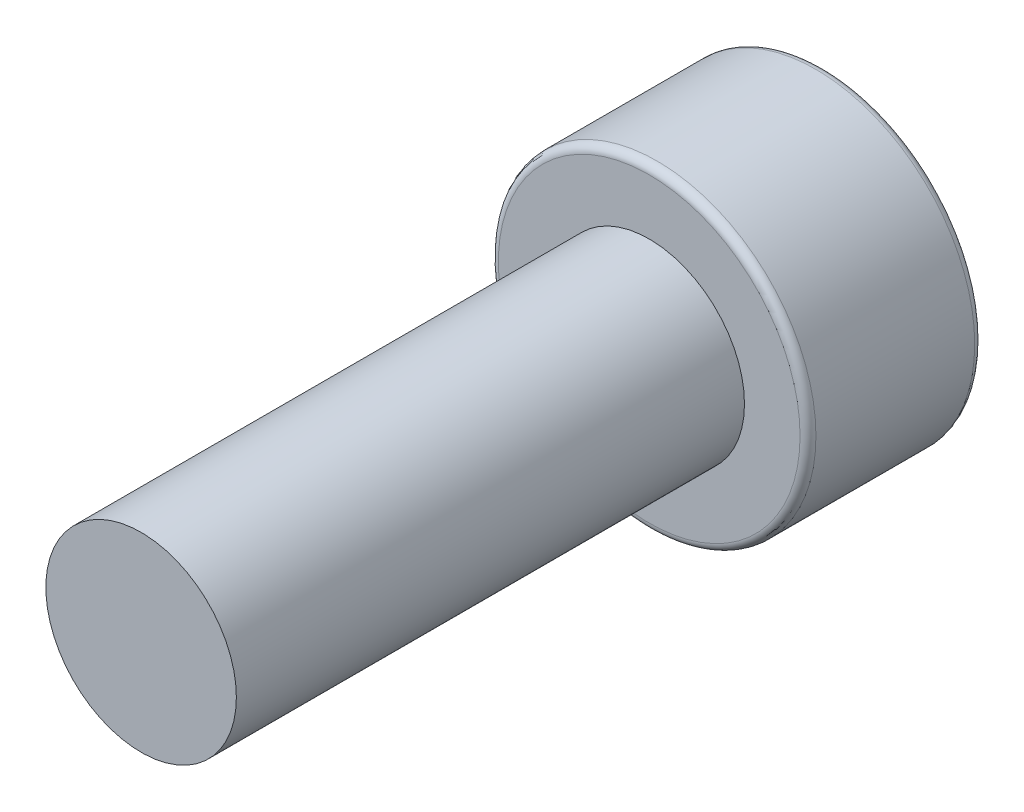
ISO-10303-21;
HEADER;
FILE_DESCRIPTION(('STEP AP214'),'2;1');
FILE_NAME('part.step','',(''),(''),'','','');
FILE_SCHEMA(('AUTOMOTIVE_DESIGN { 1 0 10303 214 1 1 1 1 }'));
ENDSEC;
DATA;
#1=APPLICATION_CONTEXT('core data for automotive mechanical design processes');
#2=APPLICATION_PROTOCOL_DEFINITION('international standard','automotive_design',2000,#1);
#3=PRODUCT_CONTEXT('',#1,'mechanical');
#4=PRODUCT('Part','Part','',(#3));
#5=PRODUCT_RELATED_PRODUCT_CATEGORY('part','',(#4));
#6=PRODUCT_DEFINITION_FORMATION('','',#4);
#7=PRODUCT_DEFINITION_CONTEXT('part definition',#1,'design');
#8=PRODUCT_DEFINITION('design','',#6,#7);
#9=PRODUCT_DEFINITION_SHAPE('','',#8);
#10=(LENGTH_UNIT() NAMED_UNIT(*) SI_UNIT(.MILLI.,.METRE.));
#11=(NAMED_UNIT(*) PLANE_ANGLE_UNIT() SI_UNIT($,.RADIAN.));
#12=(NAMED_UNIT(*) SI_UNIT($,.STERADIAN.) SOLID_ANGLE_UNIT());
#13=UNCERTAINTY_MEASURE_WITH_UNIT(LENGTH_MEASURE(1.E-05),#10,'distance_accuracy_value','');
#14=(GEOMETRIC_REPRESENTATION_CONTEXT(3) GLOBAL_UNCERTAINTY_ASSIGNED_CONTEXT((#13)) GLOBAL_UNIT_ASSIGNED_CONTEXT((#10,
#11,#12)) REPRESENTATION_CONTEXT('',''));
#15=CARTESIAN_POINT('',(0.,0.,0.));
#16=DIRECTION('',(0.,0.,1.));
#17=DIRECTION('',(1.,0.,0.));
#18=AXIS2_PLACEMENT_3D('',#15,#16,#17);
#19=CARTESIAN_POINT('',(0.,0.,2.75));
#20=DIRECTION('',(0.,0.,1.));
#21=DIRECTION('',(1.,0.,0.));
#22=AXIS2_PLACEMENT_3D('',#19,#20,#21);
#23=PLANE('',#22);
#24=CARTESIAN_POINT('',(0.,0.,2.75));
#25=DIRECTION('',(0.,0.,1.));
#26=DIRECTION('',(1.,0.,0.));
#27=AXIS2_PLACEMENT_3D('',#24,#25,#26);
#28=CIRCLE('',#27,2.375);
#29=CARTESIAN_POINT('',(2.375,0.,2.75));
#30=VERTEX_POINT('',#29);
#31=EDGE_CURVE('E11',#30,#30,#28,.T.);
#32=ORIENTED_EDGE('',*,*,#31,.T.);
#33=EDGE_LOOP('',(#32));
#34=FACE_BOUND('',#33,.T.);
#35=CARTESIAN_POINT('',(0.,0.,2.75));
#36=DIRECTION('',(0.,0.,1.));
#37=DIRECTION('',(1.,0.,0.));
#38=AXIS2_PLACEMENT_3D('',#35,#36,#37);
#39=CIRCLE('',#38,1.5);
#40=CARTESIAN_POINT('',(1.5,0.,2.75));
#41=VERTEX_POINT('',#40);
#42=EDGE_CURVE('E267',#41,#41,#39,.T.);
#43=ORIENTED_EDGE('',*,*,#42,.F.);
#44=EDGE_LOOP('',(#43));
#45=FACE_BOUND('',#44,.T.);
#46=ADVANCED_FACE('F33',(#34,#45),#23,.T.);
#47=CARTESIAN_POINT('',(0.,0.,2.75));
#48=DIRECTION('',(0.,0.,-1.));
#49=DIRECTION('',(-1.,0.,0.));
#50=AXIS2_PLACEMENT_3D('',#47,#48,#49);
#51=CYLINDRICAL_SURFACE('',#50,2.5);
#52=CARTESIAN_POINT('',(0.,0.,0.125));
#53=DIRECTION('',(0.,0.,1.));
#54=DIRECTION('',(1.,0.,0.));
#55=AXIS2_PLACEMENT_3D('',#52,#53,#54);
#56=CIRCLE('',#55,2.5);
#57=CARTESIAN_POINT('',(2.5,0.,0.125));
#58=VERTEX_POINT('',#57);
#59=EDGE_CURVE('E42',#58,#58,#56,.T.);
#60=ORIENTED_EDGE('',*,*,#59,.T.);
#61=EDGE_LOOP('',(#60));
#62=FACE_BOUND('',#61,.T.);
#63=CARTESIAN_POINT('',(0.,0.,2.625));
#64=DIRECTION('',(0.,0.,1.));
#65=DIRECTION('',(1.,0.,0.));
#66=AXIS2_PLACEMENT_3D('',#63,#64,#65);
#67=CIRCLE('',#66,2.5);
#68=CARTESIAN_POINT('',(2.5,0.,2.625));
#69=VERTEX_POINT('',#68);
#70=EDGE_CURVE('E208',#69,#69,#67,.F.);
#71=ORIENTED_EDGE('',*,*,#70,.T.);
#72=EDGE_LOOP('',(#71));
#73=FACE_BOUND('',#72,.T.);
#74=ADVANCED_FACE('F314',(#62,#73),#51,.T.);
#75=CARTESIAN_POINT('',(0.,0.,0.));
#76=DIRECTION('',(0.,0.,1.));
#77=DIRECTION('',(1.,0.,0.));
#78=AXIS2_PLACEMENT_3D('',#75,#76,#77);
#79=PLANE('',#78);
#80=DIRECTION('',(0.5,-0.866025403784439,0.));
#81=VECTOR('',#80,1.);
#82=CARTESIAN_POINT('',(1.1907849302036,0.6875,0.));
#83=LINE('',#82,#81);
#84=CARTESIAN_POINT('',(1.58771324027147,0.,0.));
#85=VERTEX_POINT('',#84);
#86=CARTESIAN_POINT('',(0.793856620135735,1.375,0.));
#87=VERTEX_POINT('',#86);
#88=EDGE_CURVE('E195',#85,#87,#83,.F.);
#89=ORIENTED_EDGE('',*,*,#88,.T.);
#90=DIRECTION('',(1.,0.,0.));
#91=VECTOR('',#90,1.);
#92=CARTESIAN_POINT('',(0.,1.375,0.));
#93=LINE('',#92,#91);
#94=CARTESIAN_POINT('',(-0.793856620135735,1.375,0.));
#95=VERTEX_POINT('',#94);
#96=EDGE_CURVE('E197',#87,#95,#93,.F.);
#97=ORIENTED_EDGE('',*,*,#96,.T.);
#98=DIRECTION('',(0.5,0.866025403784438,0.));
#99=VECTOR('',#98,1.);
#100=CARTESIAN_POINT('',(-1.1907849302036,0.687500000000001,0.));
#101=LINE('',#100,#99);
#102=CARTESIAN_POINT('',(-1.58771324027147,0.,0.));
#103=VERTEX_POINT('',#102);
#104=EDGE_CURVE('E187',#95,#103,#101,.F.);
#105=ORIENTED_EDGE('',*,*,#104,.T.);
#106=DIRECTION('',(-0.5,0.866025403784439,0.));
#107=VECTOR('',#106,1.);
#108=CARTESIAN_POINT('',(-1.1907849302036,-0.6875,0.));
#109=LINE('',#108,#107);
#110=CARTESIAN_POINT('',(-0.793856620135736,-1.375,0.));
#111=VERTEX_POINT('',#110);
#112=EDGE_CURVE('E189',#103,#111,#109,.F.);
#113=ORIENTED_EDGE('',*,*,#112,.T.);
#114=DIRECTION('',(-1.,0.,0.));
#115=VECTOR('',#114,1.);
#116=CARTESIAN_POINT('',(0.,-1.375,0.));
#117=LINE('',#116,#115);
#118=CARTESIAN_POINT('',(0.793856620135735,-1.375,0.));
#119=VERTEX_POINT('',#118);
#120=EDGE_CURVE('E191',#111,#119,#117,.F.);
#121=ORIENTED_EDGE('',*,*,#120,.T.);
#122=DIRECTION('',(-0.5,-0.866025403784439,0.));
#123=VECTOR('',#122,1.);
#124=CARTESIAN_POINT('',(1.1907849302036,-0.6875,0.));
#125=LINE('',#124,#123);
#126=EDGE_CURVE('E193',#119,#85,#125,.F.);
#127=ORIENTED_EDGE('',*,*,#126,.T.);
#128=EDGE_LOOP('',(#89,#97,#105,#113,#121,#127));
#129=FACE_BOUND('',#128,.T.);
#130=CARTESIAN_POINT('',(0.,0.,0.));
#131=DIRECTION('',(0.,0.,1.));
#132=DIRECTION('',(1.,0.,0.));
#133=AXIS2_PLACEMENT_3D('',#130,#131,#132);
#134=CIRCLE('',#133,2.375);
#135=CARTESIAN_POINT('',(2.375,0.,0.));
#136=VERTEX_POINT('',#135);
#137=EDGE_CURVE('E184',#136,#136,#134,.F.);
#138=ORIENTED_EDGE('',*,*,#137,.T.);
#139=EDGE_LOOP('',(#138));
#140=FACE_BOUND('',#139,.T.);
#141=ADVANCED_FACE('F238',(#129,#140),#79,.F.);
#142=CARTESIAN_POINT('',(0.,0.,10.75));
#143=DIRECTION('',(0.,0.,-1.));
#144=DIRECTION('',(-1.,0.,0.));
#145=AXIS2_PLACEMENT_3D('',#142,#143,#144);
#146=CYLINDRICAL_SURFACE('',#145,1.5);
#147=CARTESIAN_POINT('',(0.,0.,10.75));
#148=DIRECTION('',(0.,0.,1.));
#149=DIRECTION('',(1.,0.,0.));
#150=AXIS2_PLACEMENT_3D('',#147,#148,#149);
#151=CIRCLE('',#150,1.5);
#152=CARTESIAN_POINT('',(1.5,0.,10.75));
#153=VERTEX_POINT('',#152);
#154=EDGE_CURVE('E147',#153,#153,#151,.T.);
#155=ORIENTED_EDGE('',*,*,#154,.F.);
#156=EDGE_LOOP('',(#155));
#157=FACE_BOUND('',#156,.T.);
#158=ORIENTED_EDGE('',*,*,#42,.T.);
#159=EDGE_LOOP('',(#158));
#160=FACE_BOUND('',#159,.T.);
#161=ADVANCED_FACE('F325',(#157,#160),#146,.T.);
#162=CARTESIAN_POINT('',(0.,0.,10.75));
#163=DIRECTION('',(0.,0.,1.));
#164=DIRECTION('',(1.,0.,0.));
#165=AXIS2_PLACEMENT_3D('',#162,#163,#164);
#166=PLANE('',#165);
#167=ORIENTED_EDGE('',*,*,#154,.T.);
#168=EDGE_LOOP('',(#167));
#169=FACE_BOUND('',#168,.T.);
#170=ADVANCED_FACE('F362',(#169),#166,.T.);
#171=CARTESIAN_POINT('',(-0.721687836487033,-1.25,2.));
#172=DIRECTION('',(-0.866025403784439,-0.5,0.));
#173=DIRECTION('',(0.5,-0.866025403784439,0.));
#174=AXIS2_PLACEMENT_3D('',#171,#172,#173);
#175=PLANE('',#174);
#176=DIRECTION('',(0.,0.,-1.));
#177=VECTOR('',#176,1.);
#178=CARTESIAN_POINT('',(-0.721687836487033,-1.25,2.));
#179=LINE('',#178,#177);
#180=CARTESIAN_POINT('',(-0.721687836487033,-1.25,1.75));
#181=VERTEX_POINT('',#180);
#182=CARTESIAN_POINT('',(-0.721687836487033,-1.25,0.125));
#183=VERTEX_POINT('',#182);
#184=EDGE_CURVE('E269',#181,#183,#179,.T.);
#185=ORIENTED_EDGE('',*,*,#184,.T.);
#186=DIRECTION('',(-0.5,0.866025403784439,0.));
#187=VECTOR('',#186,1.);
#188=CARTESIAN_POINT('',(-0.721687836487033,-1.25,0.125));
#189=LINE('',#188,#187);
#190=CARTESIAN_POINT('',(-1.44337567297406,0.,0.125));
#191=VERTEX_POINT('',#190);
#192=EDGE_CURVE('E50',#183,#191,#189,.T.);
#193=ORIENTED_EDGE('',*,*,#192,.T.);
#194=DIRECTION('',(0.,0.,-1.));
#195=VECTOR('',#194,1.);
#196=CARTESIAN_POINT('',(-1.44337567297406,0.,2.));
#197=LINE('',#196,#195);
#198=CARTESIAN_POINT('',(-1.44337567297406,0.,1.75));
#199=VERTEX_POINT('',#198);
#200=EDGE_CURVE('E181',#199,#191,#197,.T.);
#201=ORIENTED_EDGE('',*,*,#200,.F.);
#202=DIRECTION('',(0.5,-0.866025403784439,0.));
#203=VECTOR('',#202,1.);
#204=CARTESIAN_POINT('',(-0.721687836487033,-1.25,1.75));
#205=LINE('',#204,#203);
#206=EDGE_CURVE('E134',#199,#181,#205,.T.);
#207=ORIENTED_EDGE('',*,*,#206,.T.);
#208=EDGE_LOOP('',(#185,#193,#201,#207));
#209=FACE_BOUND('',#208,.T.);
#210=ADVANCED_FACE('F284',(#209),#175,.F.);
#211=CARTESIAN_POINT('',(0.721687836487032,-1.25,2.));
#212=DIRECTION('',(0.,-1.,0.));
#213=DIRECTION('',(0.,0.,-1.));
#214=AXIS2_PLACEMENT_3D('',#211,#212,#213);
#215=PLANE('',#214);
#216=DIRECTION('',(0.,0.,-1.));
#217=VECTOR('',#216,1.);
#218=CARTESIAN_POINT('',(0.721687836487032,-1.25,2.));
#219=LINE('',#218,#217);
#220=CARTESIAN_POINT('',(0.721687836487032,-1.25,1.75));
#221=VERTEX_POINT('',#220);
#222=CARTESIAN_POINT('',(0.721687836487032,-1.25,0.125));
#223=VERTEX_POINT('',#222);
#224=EDGE_CURVE('E286',#221,#223,#219,.T.);
#225=ORIENTED_EDGE('',*,*,#224,.T.);
#226=DIRECTION('',(-1.,0.,0.));
#227=VECTOR('',#226,1.);
#228=CARTESIAN_POINT('',(0.721687836487032,-1.25,0.125));
#229=LINE('',#228,#227);
#230=EDGE_CURVE('E58',#223,#183,#229,.T.);
#231=ORIENTED_EDGE('',*,*,#230,.T.);
#232=ORIENTED_EDGE('',*,*,#184,.F.);
#233=DIRECTION('',(1.,0.,0.));
#234=VECTOR('',#233,1.);
#235=CARTESIAN_POINT('',(0.721687836487032,-1.25,1.75));
#236=LINE('',#235,#234);
#237=EDGE_CURVE('E154',#181,#221,#236,.T.);
#238=ORIENTED_EDGE('',*,*,#237,.T.);
#239=EDGE_LOOP('',(#225,#231,#232,#238));
#240=FACE_BOUND('',#239,.T.);
#241=ADVANCED_FACE('F285',(#240),#215,.F.);
#242=CARTESIAN_POINT('',(1.44337567297406,0.,2.));
#243=DIRECTION('',(0.866025403784439,-0.5,0.));
#244=DIRECTION('',(0.5,0.866025403784439,0.));
#245=AXIS2_PLACEMENT_3D('',#242,#243,#244);
#246=PLANE('',#245);
#247=DIRECTION('',(0.,0.,-1.));
#248=VECTOR('',#247,1.);
#249=CARTESIAN_POINT('',(1.44337567297406,0.,2.));
#250=LINE('',#249,#248);
#251=CARTESIAN_POINT('',(1.44337567297406,0.,1.75));
#252=VERTEX_POINT('',#251);
#253=CARTESIAN_POINT('',(1.44337567297406,0.,0.125));
#254=VERTEX_POINT('',#253);
#255=EDGE_CURVE('E260',#252,#254,#250,.T.);
#256=ORIENTED_EDGE('',*,*,#255,.T.);
#257=DIRECTION('',(-0.5,-0.866025403784439,0.));
#258=VECTOR('',#257,1.);
#259=CARTESIAN_POINT('',(1.44337567297406,0.,0.125));
#260=LINE('',#259,#258);
#261=EDGE_CURVE('E202',#254,#223,#260,.T.);
#262=ORIENTED_EDGE('',*,*,#261,.T.);
#263=ORIENTED_EDGE('',*,*,#224,.F.);
#264=DIRECTION('',(0.5,0.866025403784439,0.));
#265=VECTOR('',#264,1.);
#266=CARTESIAN_POINT('',(1.44337567297406,0.,1.75));
#267=LINE('',#266,#265);
#268=EDGE_CURVE('E161',#221,#252,#267,.T.);
#269=ORIENTED_EDGE('',*,*,#268,.T.);
#270=EDGE_LOOP('',(#256,#262,#263,#269));
#271=FACE_BOUND('',#270,.T.);
#272=ADVANCED_FACE('F292',(#271),#246,.F.);
#273=CARTESIAN_POINT('',(0.721687836487032,1.25,2.));
#274=DIRECTION('',(0.866025403784439,0.5,0.));
#275=DIRECTION('',(-0.5,0.866025403784439,0.));
#276=AXIS2_PLACEMENT_3D('',#273,#274,#275);
#277=PLANE('',#276);
#278=DIRECTION('',(0.,0.,-1.));
#279=VECTOR('',#278,1.);
#280=CARTESIAN_POINT('',(0.721687836487032,1.25,2.));
#281=LINE('',#280,#279);
#282=CARTESIAN_POINT('',(0.721687836487032,1.25,1.75));
#283=VERTEX_POINT('',#282);
#284=CARTESIAN_POINT('',(0.721687836487032,1.25,0.125));
#285=VERTEX_POINT('',#284);
#286=EDGE_CURVE('E258',#283,#285,#281,.T.);
#287=ORIENTED_EDGE('',*,*,#286,.T.);
#288=DIRECTION('',(0.5,-0.866025403784439,0.));
#289=VECTOR('',#288,1.);
#290=CARTESIAN_POINT('',(0.721687836487032,1.25,0.125));
#291=LINE('',#290,#289);
#292=EDGE_CURVE('E200',#285,#254,#291,.T.);
#293=ORIENTED_EDGE('',*,*,#292,.T.);
#294=ORIENTED_EDGE('',*,*,#255,.F.);
#295=DIRECTION('',(-0.5,0.866025403784439,0.));
#296=VECTOR('',#295,1.);
#297=CARTESIAN_POINT('',(0.721687836487032,1.25,1.75));
#298=LINE('',#297,#296);
#299=EDGE_CURVE('E163',#252,#283,#298,.T.);
#300=ORIENTED_EDGE('',*,*,#299,.T.);
#301=EDGE_LOOP('',(#287,#293,#294,#300));
#302=FACE_BOUND('',#301,.T.);
#303=ADVANCED_FACE('F348',(#302),#277,.F.);
#304=CARTESIAN_POINT('',(-0.721687836487032,1.25,2.));
#305=DIRECTION('',(0.,1.,0.));
#306=DIRECTION('',(0.,0.,1.));
#307=AXIS2_PLACEMENT_3D('',#304,#305,#306);
#308=PLANE('',#307);
#309=DIRECTION('',(0.,0.,-1.));
#310=VECTOR('',#309,1.);
#311=CARTESIAN_POINT('',(-0.721687836487032,1.25,2.));
#312=LINE('',#311,#310);
#313=CARTESIAN_POINT('',(-0.721687836487032,1.25,1.75));
#314=VERTEX_POINT('',#313);
#315=CARTESIAN_POINT('',(-0.721687836487032,1.25,0.125));
#316=VERTEX_POINT('',#315);
#317=EDGE_CURVE('E252',#314,#316,#312,.T.);
#318=ORIENTED_EDGE('',*,*,#317,.T.);
#319=DIRECTION('',(1.,0.,0.));
#320=VECTOR('',#319,1.);
#321=CARTESIAN_POINT('',(-0.721687836487032,1.25,0.125));
#322=LINE('',#321,#320);
#323=EDGE_CURVE('E168',#316,#285,#322,.T.);
#324=ORIENTED_EDGE('',*,*,#323,.T.);
#325=ORIENTED_EDGE('',*,*,#286,.F.);
#326=DIRECTION('',(-1.,0.,0.));
#327=VECTOR('',#326,1.);
#328=CARTESIAN_POINT('',(-0.721687836487032,1.25,1.75));
#329=LINE('',#328,#327);
#330=EDGE_CURVE('E165',#283,#314,#329,.T.);
#331=ORIENTED_EDGE('',*,*,#330,.T.);
#332=EDGE_LOOP('',(#318,#324,#325,#331));
#333=FACE_BOUND('',#332,.T.);
#334=ADVANCED_FACE('F254',(#333),#308,.F.);
#335=CARTESIAN_POINT('',(-1.44337567297406,0.,2.));
#336=DIRECTION('',(-0.866025403784438,0.5,0.));
#337=DIRECTION('',(-0.5,-0.866025403784438,0.));
#338=AXIS2_PLACEMENT_3D('',#335,#336,#337);
#339=PLANE('',#338);
#340=ORIENTED_EDGE('',*,*,#200,.T.);
#341=DIRECTION('',(0.5,0.866025403784438,0.));
#342=VECTOR('',#341,1.);
#343=CARTESIAN_POINT('',(-1.44337567297406,0.,0.125));
#344=LINE('',#343,#342);
#345=EDGE_CURVE('E206',#191,#316,#344,.T.);
#346=ORIENTED_EDGE('',*,*,#345,.T.);
#347=ORIENTED_EDGE('',*,*,#317,.F.);
#348=DIRECTION('',(-0.5,-0.866025403784438,0.));
#349=VECTOR('',#348,1.);
#350=CARTESIAN_POINT('',(-1.44337567297406,0.,1.75));
#351=LINE('',#350,#349);
#352=EDGE_CURVE('E167',#314,#199,#351,.T.);
#353=ORIENTED_EDGE('',*,*,#352,.T.);
#354=EDGE_LOOP('',(#340,#346,#347,#353));
#355=FACE_BOUND('',#354,.T.);
#356=ADVANCED_FACE('F251',(#355),#339,.F.);
#357=CARTESIAN_POINT('',(0.,0.,2.));
#358=DIRECTION('',(0.,0.,-1.));
#359=DIRECTION('',(-1.,0.,0.));
#360=AXIS2_PLACEMENT_3D('',#357,#358,#359);
#361=PLANE('',#360);
#362=DIRECTION('',(-1.,0.,0.));
#363=VECTOR('',#362,1.);
#364=CARTESIAN_POINT('',(0.,-0.999999999999994,2.));
#365=LINE('',#364,#363);
#366=CARTESIAN_POINT('',(0.577350269189623,-0.999999999999994,2.));
#367=VERTEX_POINT('',#366);
#368=CARTESIAN_POINT('',(-0.577350269189623,-0.999999999999994,2.));
#369=VERTEX_POINT('',#368);
#370=EDGE_CURVE('E151',#367,#369,#365,.T.);
#371=ORIENTED_EDGE('',*,*,#370,.T.);
#372=DIRECTION('',(-0.5,0.866025403784439,0.));
#373=VECTOR('',#372,1.);
#374=CARTESIAN_POINT('',(-0.866025403784434,-0.499999999999997,2.));
#375=LINE('',#374,#373);
#376=CARTESIAN_POINT('',(-1.15470053837925,0.,2.));
#377=VERTEX_POINT('',#376);
#378=EDGE_CURVE('E132',#369,#377,#375,.T.);
#379=ORIENTED_EDGE('',*,*,#378,.T.);
#380=DIRECTION('',(0.5,0.866025403784439,0.));
#381=VECTOR('',#380,1.);
#382=CARTESIAN_POINT('',(-0.866025403784434,0.499999999999998,2.));
#383=LINE('',#382,#381);
#384=CARTESIAN_POINT('',(-0.577350269189622,0.999999999999995,2.));
#385=VERTEX_POINT('',#384);
#386=EDGE_CURVE('E140',#377,#385,#383,.T.);
#387=ORIENTED_EDGE('',*,*,#386,.T.);
#388=DIRECTION('',(1.,0.,0.));
#389=VECTOR('',#388,1.);
#390=CARTESIAN_POINT('',(0.,0.999999999999995,2.));
#391=LINE('',#390,#389);
#392=CARTESIAN_POINT('',(0.577350269189622,0.999999999999995,2.));
#393=VERTEX_POINT('',#392);
#394=EDGE_CURVE('E146',#385,#393,#391,.T.);
#395=ORIENTED_EDGE('',*,*,#394,.T.);
#396=DIRECTION('',(0.5,-0.866025403784439,0.));
#397=VECTOR('',#396,1.);
#398=CARTESIAN_POINT('',(0.866025403784434,0.499999999999997,2.));
#399=LINE('',#398,#397);
#400=CARTESIAN_POINT('',(1.15470053837925,0.,2.));
#401=VERTEX_POINT('',#400);
#402=EDGE_CURVE('E272',#393,#401,#399,.T.);
#403=ORIENTED_EDGE('',*,*,#402,.T.);
#404=DIRECTION('',(-0.5,-0.866025403784439,0.));
#405=VECTOR('',#404,1.);
#406=CARTESIAN_POINT('',(0.866025403784434,-0.499999999999998,2.));
#407=LINE('',#406,#405);
#408=EDGE_CURVE('E156',#401,#367,#407,.T.);
#409=ORIENTED_EDGE('',*,*,#408,.T.);
#410=EDGE_LOOP('',(#371,#379,#387,#395,#403,#409));
#411=FACE_BOUND('',#410,.T.);
#412=ADVANCED_FACE('F149',(#411),#361,.T.);
#413=CARTESIAN_POINT('',(0.866025403784434,0.499999999999997,2.));
#414=DIRECTION('',(0.61237243569579,0.353553390593271,0.707106781186552));
#415=DIRECTION('',(0.5,-0.866025403784439,0.));
#416=AXIS2_PLACEMENT_3D('',#413,#414,#415);
#417=PLANE('',#416);
#418=DIRECTION('',(-0.37796447300923,-0.654653670707981,0.654653670707972));
#419=VECTOR('',#418,1.);
#420=CARTESIAN_POINT('',(0.49487165930539,0.857142857142851,2.14285714285714));
#421=LINE('',#420,#419);
#422=EDGE_CURVE('E175',#283,#393,#421,.T.);
#423=ORIENTED_EDGE('',*,*,#422,.F.);
#424=ORIENTED_EDGE('',*,*,#299,.F.);
#425=DIRECTION('',(-0.755928946018459,0.,0.654653670707972));
#426=VECTOR('',#425,1.);
#427=CARTESIAN_POINT('',(0.98974331861078,0.,2.14285714285714));
#428=LINE('',#427,#426);
#429=EDGE_CURVE('E178',#401,#252,#428,.F.);
#430=ORIENTED_EDGE('',*,*,#429,.F.);
#431=ORIENTED_EDGE('',*,*,#402,.F.);
#432=EDGE_LOOP('',(#423,#424,#430,#431));
#433=FACE_BOUND('',#432,.T.);
#434=ADVANCED_FACE('F340',(#433),#417,.F.);
#435=CARTESIAN_POINT('',(0.866025403784434,-0.499999999999998,2.));
#436=DIRECTION('',(0.612372435695791,-0.353553390593272,0.707106781186552));
#437=DIRECTION('',(-0.5,-0.866025403784439,0.));
#438=AXIS2_PLACEMENT_3D('',#435,#436,#437);
#439=PLANE('',#438);
#440=ORIENTED_EDGE('',*,*,#429,.T.);
#441=ORIENTED_EDGE('',*,*,#268,.F.);
#442=DIRECTION('',(-0.377964473009229,0.654653670707981,0.654653670707973));
#443=VECTOR('',#442,1.);
#444=CARTESIAN_POINT('',(0.49487165930539,-0.857142857142851,2.14285714285714));
#445=LINE('',#444,#443);
#446=EDGE_CURVE('E172',#367,#221,#445,.F.);
#447=ORIENTED_EDGE('',*,*,#446,.F.);
#448=ORIENTED_EDGE('',*,*,#408,.F.);
#449=EDGE_LOOP('',(#440,#441,#447,#448));
#450=FACE_BOUND('',#449,.T.);
#451=ADVANCED_FACE('F279',(#450),#439,.F.);
#452=CARTESIAN_POINT('',(0.,0.999999999999995,2.));
#453=DIRECTION('',(0.,0.707106781186543,0.707106781186552));
#454=DIRECTION('',(1.,0.,0.));
#455=AXIS2_PLACEMENT_3D('',#452,#453,#454);
#456=PLANE('',#455);
#457=ORIENTED_EDGE('',*,*,#422,.T.);
#458=ORIENTED_EDGE('',*,*,#394,.F.);
#459=DIRECTION('',(0.377964473009229,-0.654653670707981,0.654653670707973));
#460=VECTOR('',#459,1.);
#461=CARTESIAN_POINT('',(-0.49487165930539,0.857142857142851,2.14285714285714));
#462=LINE('',#461,#460);
#463=EDGE_CURVE('E143',#314,#385,#462,.T.);
#464=ORIENTED_EDGE('',*,*,#463,.F.);
#465=ORIENTED_EDGE('',*,*,#330,.F.);
#466=EDGE_LOOP('',(#457,#458,#464,#465));
#467=FACE_BOUND('',#466,.T.);
#468=ADVANCED_FACE('F335',(#467),#456,.F.);
#469=CARTESIAN_POINT('',(0.,-0.999999999999994,2.));
#470=DIRECTION('',(0.,-0.707106781186543,0.707106781186552));
#471=DIRECTION('',(-1.,0.,0.));
#472=AXIS2_PLACEMENT_3D('',#469,#470,#471);
#473=PLANE('',#472);
#474=ORIENTED_EDGE('',*,*,#446,.T.);
#475=ORIENTED_EDGE('',*,*,#237,.F.);
#476=DIRECTION('',(0.37796447300923,0.654653670707981,0.654653670707972));
#477=VECTOR('',#476,1.);
#478=CARTESIAN_POINT('',(-0.49487165930539,-0.857142857142851,2.14285714285714));
#479=LINE('',#478,#477);
#480=EDGE_CURVE('E137',#369,#181,#479,.F.);
#481=ORIENTED_EDGE('',*,*,#480,.F.);
#482=ORIENTED_EDGE('',*,*,#370,.F.);
#483=EDGE_LOOP('',(#474,#475,#481,#482));
#484=FACE_BOUND('',#483,.T.);
#485=ADVANCED_FACE('F282',(#484),#473,.F.);
#486=CARTESIAN_POINT('',(-0.866025403784434,0.499999999999998,2.));
#487=DIRECTION('',(-0.612372435695791,0.353553390593272,0.707106781186552));
#488=DIRECTION('',(0.5,0.866025403784438,0.));
#489=AXIS2_PLACEMENT_3D('',#486,#487,#488);
#490=PLANE('',#489);
#491=ORIENTED_EDGE('',*,*,#463,.T.);
#492=ORIENTED_EDGE('',*,*,#386,.F.);
#493=DIRECTION('',(-0.755928946018459,0.,-0.654653670707972));
#494=VECTOR('',#493,1.);
#495=CARTESIAN_POINT('',(-0.98974331861078,0.,2.14285714285714));
#496=LINE('',#495,#494);
#497=EDGE_CURVE('E128',#199,#377,#496,.F.);
#498=ORIENTED_EDGE('',*,*,#497,.F.);
#499=ORIENTED_EDGE('',*,*,#352,.F.);
#500=EDGE_LOOP('',(#491,#492,#498,#499));
#501=FACE_BOUND('',#500,.T.);
#502=ADVANCED_FACE('F141',(#501),#490,.F.);
#503=CARTESIAN_POINT('',(-0.866025403784434,-0.499999999999997,2.));
#504=DIRECTION('',(-0.61237243569579,-0.353553390593271,0.707106781186552));
#505=DIRECTION('',(-0.5,0.866025403784439,0.));
#506=AXIS2_PLACEMENT_3D('',#503,#504,#505);
#507=PLANE('',#506);
#508=ORIENTED_EDGE('',*,*,#480,.T.);
#509=ORIENTED_EDGE('',*,*,#206,.F.);
#510=ORIENTED_EDGE('',*,*,#497,.T.);
#511=ORIENTED_EDGE('',*,*,#378,.F.);
#512=EDGE_LOOP('',(#508,#509,#510,#511));
#513=FACE_BOUND('',#512,.T.);
#514=ADVANCED_FACE('F130',(#513),#507,.F.);
#515=CARTESIAN_POINT('',(0.721687836487032,-1.375,0.125));
#516=DIRECTION('',(-1.,0.,0.));
#517=DIRECTION('',(0.,0.,1.));
#518=AXIS2_PLACEMENT_3D('',#515,#516,#517);
#519=CYLINDRICAL_SURFACE('',#518,0.125);
#520=CARTESIAN_POINT('',(0.793856620135735,-1.375,0.125));
#521=DIRECTION('',(-0.866025403784439,-0.5,0.));
#522=DIRECTION('',(0.5,-0.866025403784439,0.));
#523=AXIS2_PLACEMENT_3D('',#520,#521,#522);
#524=ELLIPSE('',#523,0.144337567297406,0.125);
#525=EDGE_CURVE('E222',#119,#223,#524,.F.);
#526=ORIENTED_EDGE('',*,*,#525,.F.);
#527=ORIENTED_EDGE('',*,*,#120,.F.);
#528=CARTESIAN_POINT('',(-0.793856620135737,-1.375,0.125));
#529=DIRECTION('',(-0.866025403784439,0.5,0.));
#530=DIRECTION('',(-0.5,-0.866025403784439,0.));
#531=AXIS2_PLACEMENT_3D('',#528,#529,#530);
#532=ELLIPSE('',#531,0.144337567297406,0.125);
#533=EDGE_CURVE('E37',#183,#111,#532,.T.);
#534=ORIENTED_EDGE('',*,*,#533,.F.);
#535=ORIENTED_EDGE('',*,*,#230,.F.);
#536=EDGE_LOOP('',(#526,#527,#534,#535));
#537=FACE_BOUND('',#536,.T.);
#538=ADVANCED_FACE('F236',(#537),#519,.T.);
#539=CARTESIAN_POINT('',(-0.829941011960088,-1.3125,0.125));
#540=DIRECTION('',(-0.5,0.866025403784439,0.));
#541=DIRECTION('',(-0.866025403784439,-0.5,0.));
#542=AXIS2_PLACEMENT_3D('',#539,#540,#541);
#543=CYLINDRICAL_SURFACE('',#542,0.125);
#544=ORIENTED_EDGE('',*,*,#533,.T.);
#545=ORIENTED_EDGE('',*,*,#112,.F.);
#546=CARTESIAN_POINT('',(-1.58771324027147,0.,0.125));
#547=DIRECTION('',(0.,1.,0.));
#548=DIRECTION('',(-1.,0.,0.));
#549=AXIS2_PLACEMENT_3D('',#546,#547,#548);
#550=ELLIPSE('',#549,0.144337567297406,0.125);
#551=EDGE_CURVE('E220',#191,#103,#550,.T.);
#552=ORIENTED_EDGE('',*,*,#551,.F.);
#553=ORIENTED_EDGE('',*,*,#192,.F.);
#554=EDGE_LOOP('',(#544,#545,#552,#553));
#555=FACE_BOUND('',#554,.T.);
#556=ADVANCED_FACE('F232',(#555),#543,.T.);
#557=CARTESIAN_POINT('',(1.55162884844712,-0.0625,0.125));
#558=DIRECTION('',(-0.5,-0.866025403784439,0.));
#559=DIRECTION('',(0.866025403784439,-0.5,0.));
#560=AXIS2_PLACEMENT_3D('',#557,#558,#559);
#561=CYLINDRICAL_SURFACE('',#560,0.125);
#562=ORIENTED_EDGE('',*,*,#525,.T.);
#563=ORIENTED_EDGE('',*,*,#261,.F.);
#564=CARTESIAN_POINT('',(1.58771324027147,0.,0.125));
#565=DIRECTION('',(0.,-1.,0.));
#566=DIRECTION('',(1.,0.,0.));
#567=AXIS2_PLACEMENT_3D('',#564,#565,#566);
#568=ELLIPSE('',#567,0.144337567297406,0.125);
#569=EDGE_CURVE('E217',#85,#254,#568,.F.);
#570=ORIENTED_EDGE('',*,*,#569,.F.);
#571=ORIENTED_EDGE('',*,*,#126,.F.);
#572=EDGE_LOOP('',(#562,#563,#570,#571));
#573=FACE_BOUND('',#572,.T.);
#574=ADVANCED_FACE('F295',(#573),#561,.T.);
#575=CARTESIAN_POINT('',(-1.55162884844712,0.0625,0.125));
#576=DIRECTION('',(0.5,0.866025403784438,0.));
#577=DIRECTION('',(-0.866025403784438,0.5,0.));
#578=AXIS2_PLACEMENT_3D('',#575,#576,#577);
#579=CYLINDRICAL_SURFACE('',#578,0.125);
#580=ORIENTED_EDGE('',*,*,#551,.T.);
#581=ORIENTED_EDGE('',*,*,#104,.F.);
#582=CARTESIAN_POINT('',(-0.793856620135735,1.375,0.125));
#583=DIRECTION('',(0.866025403784439,0.5,0.));
#584=DIRECTION('',(0.5,-0.866025403784439,0.));
#585=AXIS2_PLACEMENT_3D('',#582,#583,#584);
#586=ELLIPSE('',#585,0.144337567297406,0.125);
#587=EDGE_CURVE('E215',#316,#95,#586,.T.);
#588=ORIENTED_EDGE('',*,*,#587,.F.);
#589=ORIENTED_EDGE('',*,*,#345,.F.);
#590=EDGE_LOOP('',(#580,#581,#588,#589));
#591=FACE_BOUND('',#590,.T.);
#592=ADVANCED_FACE('F245',(#591),#579,.T.);
#593=CARTESIAN_POINT('',(0.829941011960087,1.3125,0.125));
#594=DIRECTION('',(0.5,-0.866025403784439,0.));
#595=DIRECTION('',(0.866025403784439,0.5,0.));
#596=AXIS2_PLACEMENT_3D('',#593,#594,#595);
#597=CYLINDRICAL_SURFACE('',#596,0.125);
#598=ORIENTED_EDGE('',*,*,#569,.T.);
#599=ORIENTED_EDGE('',*,*,#292,.F.);
#600=CARTESIAN_POINT('',(0.793856620135734,1.375,0.125));
#601=DIRECTION('',(0.866025403784439,-0.5,0.));
#602=DIRECTION('',(0.5,0.866025403784439,0.));
#603=AXIS2_PLACEMENT_3D('',#600,#601,#602);
#604=ELLIPSE('',#603,0.144337567297406,0.125);
#605=EDGE_CURVE('E213',#87,#285,#604,.F.);
#606=ORIENTED_EDGE('',*,*,#605,.F.);
#607=ORIENTED_EDGE('',*,*,#88,.F.);
#608=EDGE_LOOP('',(#598,#599,#606,#607));
#609=FACE_BOUND('',#608,.T.);
#610=ADVANCED_FACE('F299',(#609),#597,.T.);
#611=CARTESIAN_POINT('',(-0.721687836487032,1.375,0.125));
#612=DIRECTION('',(1.,0.,0.));
#613=DIRECTION('',(0.,0.,-1.));
#614=AXIS2_PLACEMENT_3D('',#611,#612,#613);
#615=CYLINDRICAL_SURFACE('',#614,0.125);
#616=ORIENTED_EDGE('',*,*,#587,.T.);
#617=ORIENTED_EDGE('',*,*,#96,.F.);
#618=ORIENTED_EDGE('',*,*,#605,.T.);
#619=ORIENTED_EDGE('',*,*,#323,.F.);
#620=EDGE_LOOP('',(#616,#617,#618,#619));
#621=FACE_BOUND('',#620,.T.);
#622=ADVANCED_FACE('F302',(#621),#615,.T.);
#623=CARTESIAN_POINT('',(0.,0.,0.125));
#624=DIRECTION('',(0.,0.,1.));
#625=DIRECTION('',(1.,0.,0.));
#626=AXIS2_PLACEMENT_3D('',#623,#624,#625);
#627=TOROIDAL_SURFACE('',#626,2.375,0.125);
#628=ORIENTED_EDGE('',*,*,#137,.F.);
#629=EDGE_LOOP('',(#628));
#630=FACE_BOUND('',#629,.T.);
#631=ORIENTED_EDGE('',*,*,#59,.F.);
#632=EDGE_LOOP('',(#631));
#633=FACE_BOUND('',#632,.T.);
#634=ADVANCED_FACE('F304',(#630,#633),#627,.T.);
#635=CARTESIAN_POINT('',(0.,0.,2.625));
#636=DIRECTION('',(0.,0.,1.));
#637=DIRECTION('',(1.,0.,0.));
#638=AXIS2_PLACEMENT_3D('',#635,#636,#637);
#639=TOROIDAL_SURFACE('',#638,2.375,0.125);
#640=ORIENTED_EDGE('',*,*,#70,.F.);
#641=EDGE_LOOP('',(#640));
#642=FACE_BOUND('',#641,.T.);
#643=ORIENTED_EDGE('',*,*,#31,.F.);
#644=EDGE_LOOP('',(#643));
#645=FACE_BOUND('',#644,.T.);
#646=ADVANCED_FACE('F35',(#642,#645),#639,.T.);
#647=CLOSED_SHELL('',(#46,#74,#141,#161,#170,#210,#241,#272,#303,#334,#356,#412,#434,#451,#468,
#485,#502,#514,#538,#556,#574,#592,#610,#622,#634,#646));
#648=MANIFOLD_SOLID_BREP('B2',#647);
#649=ADVANCED_BREP_SHAPE_REPRESENTATION('',(#18,#648),#14);
#650=SHAPE_DEFINITION_REPRESENTATION(#9,#649);
ENDSEC;
END-ISO-10303-21;
